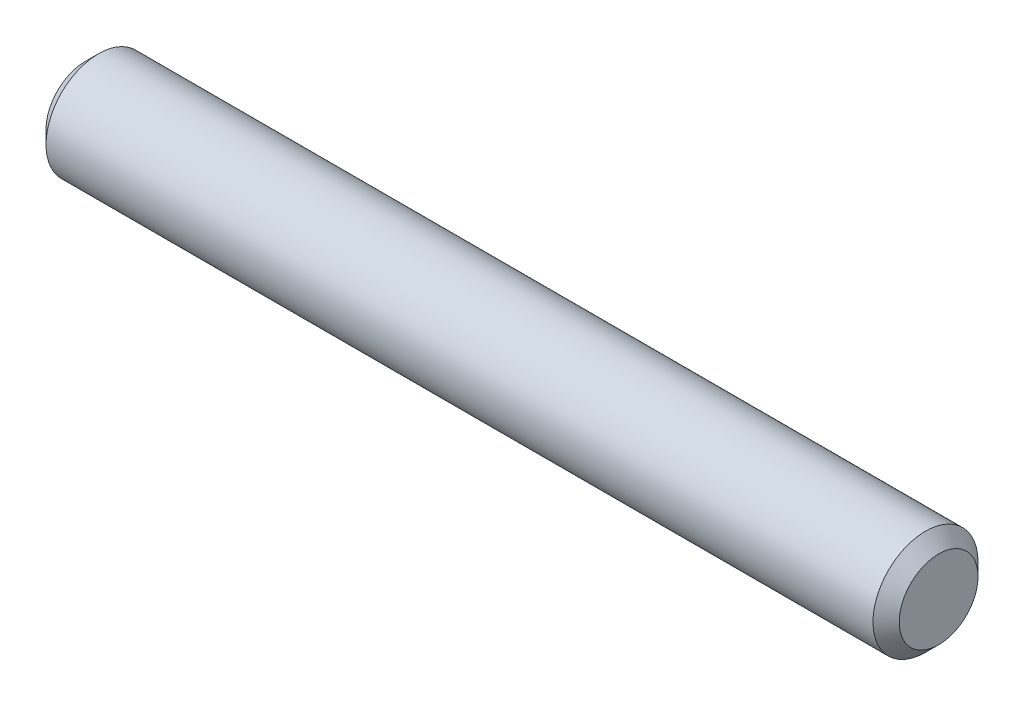
ISO-10303-21;
HEADER;
FILE_DESCRIPTION(('STEP AP214'),'2;1');
FILE_NAME('part.step','',(''),(''),'','','');
FILE_SCHEMA(('AUTOMOTIVE_DESIGN { 1 0 10303 214 1 1 1 1 }'));
ENDSEC;
DATA;
#1=APPLICATION_CONTEXT('core data for automotive mechanical design processes');
#2=APPLICATION_PROTOCOL_DEFINITION('international standard','automotive_design',2000,#1);
#3=PRODUCT_CONTEXT('',#1,'mechanical');
#4=PRODUCT('Part','Part','',(#3));
#5=PRODUCT_RELATED_PRODUCT_CATEGORY('part','',(#4));
#6=PRODUCT_DEFINITION_FORMATION('','',#4);
#7=PRODUCT_DEFINITION_CONTEXT('part definition',#1,'design');
#8=PRODUCT_DEFINITION('design','',#6,#7);
#9=PRODUCT_DEFINITION_SHAPE('','',#8);
#10=(LENGTH_UNIT() NAMED_UNIT(*) SI_UNIT(.MILLI.,.METRE.));
#11=(NAMED_UNIT(*) PLANE_ANGLE_UNIT() SI_UNIT($,.RADIAN.));
#12=(NAMED_UNIT(*) SI_UNIT($,.STERADIAN.) SOLID_ANGLE_UNIT());
#13=UNCERTAINTY_MEASURE_WITH_UNIT(LENGTH_MEASURE(1.E-05),#10,'distance_accuracy_value','');
#14=(GEOMETRIC_REPRESENTATION_CONTEXT(3) GLOBAL_UNCERTAINTY_ASSIGNED_CONTEXT((#13)) GLOBAL_UNIT_ASSIGNED_CONTEXT((#10,
#11,#12)) REPRESENTATION_CONTEXT('',''));
#15=CARTESIAN_POINT('',(0.,0.,0.));
#16=DIRECTION('',(0.,0.,1.));
#17=DIRECTION('',(1.,0.,0.));
#18=AXIS2_PLACEMENT_3D('',#15,#16,#17);
#19=CARTESIAN_POINT('',(65.,0.376369310620902,0.));
#20=DIRECTION('',(-1.,0.,0.));
#21=DIRECTION('',(0.,0.,1.));
#22=AXIS2_PLACEMENT_3D('',#19,#20,#21);
#23=CYLINDRICAL_SURFACE('',#22,4.);
#24=CARTESIAN_POINT('',(1.,0.376369310620902,0.));
#25=DIRECTION('',(1.,0.,0.));
#26=DIRECTION('',(0.,0.,-1.));
#27=AXIS2_PLACEMENT_3D('',#24,#25,#26);
#28=CIRCLE('',#27,4.);
#29=CARTESIAN_POINT('',(1.,0.376369310620902,-4.));
#30=VERTEX_POINT('',#29);
#31=EDGE_CURVE('E51',#30,#30,#28,.T.);
#32=ORIENTED_EDGE('',*,*,#31,.T.);
#33=EDGE_LOOP('',(#32));
#34=FACE_BOUND('',#33,.T.);
#35=CARTESIAN_POINT('',(64.,0.376369310620902,0.));
#36=DIRECTION('',(1.,0.,0.));
#37=DIRECTION('',(0.,0.,-1.));
#38=AXIS2_PLACEMENT_3D('',#35,#36,#37);
#39=CIRCLE('',#38,4.);
#40=CARTESIAN_POINT('',(64.,0.376369310620902,-4.));
#41=VERTEX_POINT('',#40);
#42=EDGE_CURVE('E55',#41,#41,#39,.F.);
#43=ORIENTED_EDGE('',*,*,#42,.T.);
#44=EDGE_LOOP('',(#43));
#45=FACE_BOUND('',#44,.T.);
#46=ADVANCED_FACE('F39',(#34,#45),#23,.T.);
#47=CARTESIAN_POINT('',(65.,0.376369310620902,0.));
#48=DIRECTION('',(1.,0.,0.));
#49=DIRECTION('',(0.,0.,-1.));
#50=AXIS2_PLACEMENT_3D('',#47,#48,#49);
#51=PLANE('',#50);
#52=CARTESIAN_POINT('',(65.,0.376369310620902,0.));
#53=DIRECTION('',(1.,0.,0.));
#54=DIRECTION('',(0.,0.,-1.));
#55=AXIS2_PLACEMENT_3D('',#52,#53,#54);
#56=CIRCLE('',#55,2.99999999999998);
#57=CARTESIAN_POINT('',(65.,0.376369310620902,-2.99999999999998));
#58=VERTEX_POINT('',#57);
#59=EDGE_CURVE('E10',#58,#58,#56,.T.);
#60=ORIENTED_EDGE('',*,*,#59,.T.);
#61=EDGE_LOOP('',(#60));
#62=FACE_BOUND('',#61,.T.);
#63=ADVANCED_FACE('F71',(#62),#51,.T.);
#64=CARTESIAN_POINT('',(0.,0.376369310620902,0.));
#65=DIRECTION('',(1.,0.,0.));
#66=DIRECTION('',(0.,0.,-1.));
#67=AXIS2_PLACEMENT_3D('',#64,#65,#66);
#68=PLANE('',#67);
#69=CARTESIAN_POINT('',(0.,0.376369310620902,0.));
#70=DIRECTION('',(1.,0.,0.));
#71=DIRECTION('',(0.,0.,-1.));
#72=AXIS2_PLACEMENT_3D('',#69,#70,#71);
#73=CIRCLE('',#72,3.);
#74=CARTESIAN_POINT('',(0.,0.376369310620902,-3.));
#75=VERTEX_POINT('',#74);
#76=EDGE_CURVE('E47',#75,#75,#73,.F.);
#77=ORIENTED_EDGE('',*,*,#76,.T.);
#78=EDGE_LOOP('',(#77));
#79=FACE_BOUND('',#78,.T.);
#80=ADVANCED_FACE('F68',(#79),#68,.F.);
#81=CARTESIAN_POINT('',(1.,0.376369310620902,0.));
#82=DIRECTION('',(1.,0.,0.));
#83=DIRECTION('',(0.,0.,-1.));
#84=AXIS2_PLACEMENT_3D('',#81,#82,#83);
#85=CONICAL_SURFACE('',#84,4.,0.78539816339745);
#86=ORIENTED_EDGE('',*,*,#76,.F.);
#87=EDGE_LOOP('',(#86));
#88=FACE_BOUND('',#87,.T.);
#89=ORIENTED_EDGE('',*,*,#31,.F.);
#90=EDGE_LOOP('',(#89));
#91=FACE_BOUND('',#90,.T.);
#92=ADVANCED_FACE('F64',(#88,#91),#85,.T.);
#93=CARTESIAN_POINT('',(65.,0.376369310620902,0.));
#94=DIRECTION('',(-1.,0.,0.));
#95=DIRECTION('',(0.,0.,1.));
#96=AXIS2_PLACEMENT_3D('',#93,#94,#95);
#97=CONICAL_SURFACE('',#96,2.99999999999998,0.78539816339745);
#98=ORIENTED_EDGE('',*,*,#42,.F.);
#99=EDGE_LOOP('',(#98));
#100=FACE_BOUND('',#99,.T.);
#101=ORIENTED_EDGE('',*,*,#59,.F.);
#102=EDGE_LOOP('',(#101));
#103=FACE_BOUND('',#102,.T.);
#104=ADVANCED_FACE('F42',(#100,#103),#97,.T.);
#105=CLOSED_SHELL('',(#46,#63,#80,#92,#104));
#106=MANIFOLD_SOLID_BREP('B2',#105);
#107=ADVANCED_BREP_SHAPE_REPRESENTATION('',(#18,#106),#14);
#108=SHAPE_DEFINITION_REPRESENTATION(#9,#107);
ENDSEC;
END-ISO-10303-21;
